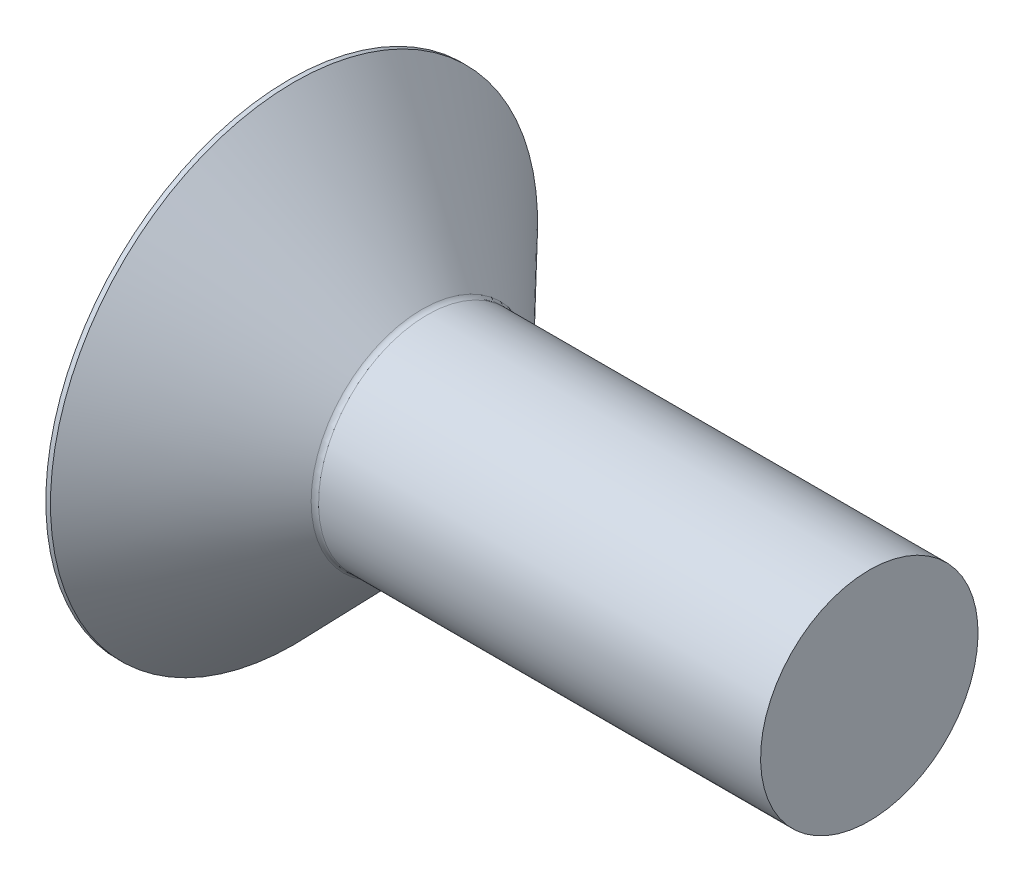
ISO-10303-21;
HEADER;
FILE_DESCRIPTION(('STEP AP214'),'2;1');
FILE_NAME('part.step','',(''),(''),'','','');
FILE_SCHEMA(('AUTOMOTIVE_DESIGN { 1 0 10303 214 1 1 1 1 }'));
ENDSEC;
DATA;
#1=APPLICATION_CONTEXT('core data for automotive mechanical design processes');
#2=APPLICATION_PROTOCOL_DEFINITION('international standard','automotive_design',2000,#1);
#3=PRODUCT_CONTEXT('',#1,'mechanical');
#4=PRODUCT('Part','Part','',(#3));
#5=PRODUCT_RELATED_PRODUCT_CATEGORY('part','',(#4));
#6=PRODUCT_DEFINITION_FORMATION('','',#4);
#7=PRODUCT_DEFINITION_CONTEXT('part definition',#1,'design');
#8=PRODUCT_DEFINITION('design','',#6,#7);
#9=PRODUCT_DEFINITION_SHAPE('','',#8);
#10=(LENGTH_UNIT() NAMED_UNIT(*) SI_UNIT(.MILLI.,.METRE.));
#11=(NAMED_UNIT(*) PLANE_ANGLE_UNIT() SI_UNIT($,.RADIAN.));
#12=(NAMED_UNIT(*) SI_UNIT($,.STERADIAN.) SOLID_ANGLE_UNIT());
#13=UNCERTAINTY_MEASURE_WITH_UNIT(LENGTH_MEASURE(1.E-05),#10,'distance_accuracy_value','');
#14=(GEOMETRIC_REPRESENTATION_CONTEXT(3) GLOBAL_UNCERTAINTY_ASSIGNED_CONTEXT((#13)) GLOBAL_UNIT_ASSIGNED_CONTEXT((#10,
#11,#12)) REPRESENTATION_CONTEXT('',''));
#15=CARTESIAN_POINT('',(0.,0.,0.));
#16=DIRECTION('',(0.,0.,1.));
#17=DIRECTION('',(1.,0.,0.));
#18=AXIS2_PLACEMENT_3D('',#15,#16,#17);
#19=CARTESIAN_POINT('',(0.,0.,0.));
#20=DIRECTION('',(1.,0.,0.));
#21=DIRECTION('',(0.,1.,0.));
#22=AXIS2_PLACEMENT_3D('',#19,#20,#21);
#23=PLANE('',#22);
#24=CARTESIAN_POINT('',(0.,0.,0.));
#25=DIRECTION('',(1.,0.,0.));
#26=DIRECTION('',(0.,1.,0.));
#27=AXIS2_PLACEMENT_3D('',#24,#25,#26);
#28=CIRCLE('',#27,1.5);
#29=CARTESIAN_POINT('',(0.,1.5,0.));
#30=VERTEX_POINT('',#29);
#31=EDGE_CURVE('E229',#30,#30,#28,.T.);
#32=ORIENTED_EDGE('',*,*,#31,.T.);
#33=EDGE_LOOP('',(#32));
#34=FACE_BOUND('',#33,.T.);
#35=ADVANCED_FACE('F53',(#34),#23,.T.);
#36=CARTESIAN_POINT('',(-8.,3.36,0.));
#37=DIRECTION('',(-1.,0.,0.));
#38=DIRECTION('',(0.,-1.,0.));
#39=AXIS2_PLACEMENT_3D('',#36,#37,#38);
#40=PLANE('',#39);
#41=CARTESIAN_POINT('',(-8.,0.,0.));
#42=DIRECTION('',(-1.,0.,0.));
#43=DIRECTION('',(0.,-1.,0.));
#44=AXIS2_PLACEMENT_3D('',#41,#42,#43);
#45=CIRCLE('',#44,1.15470053837925);
#46=CARTESIAN_POINT('',(-8.,-1.15470053837925,0.));
#47=VERTEX_POINT('',#46);
#48=CARTESIAN_POINT('',(-8.,-0.577350269189625,1.));
#49=VERTEX_POINT('',#48);
#50=EDGE_CURVE('E79',#47,#49,#45,.T.);
#51=ORIENTED_EDGE('',*,*,#50,.F.);
#52=CARTESIAN_POINT('',(-8.,-0.577350269189627,-0.999999999999999));
#53=VERTEX_POINT('',#52);
#54=EDGE_CURVE('E154',#53,#47,#45,.T.);
#55=ORIENTED_EDGE('',*,*,#54,.F.);
#56=CARTESIAN_POINT('',(-8.,0.577350269189625,-1.));
#57=VERTEX_POINT('',#56);
#58=EDGE_CURVE('E153',#57,#53,#45,.T.);
#59=ORIENTED_EDGE('',*,*,#58,.F.);
#60=CARTESIAN_POINT('',(-8.,1.15470053837925,0.));
#61=VERTEX_POINT('',#60);
#62=EDGE_CURVE('E122',#61,#57,#45,.T.);
#63=ORIENTED_EDGE('',*,*,#62,.F.);
#64=CARTESIAN_POINT('',(-8.,0.577350269189629,1.));
#65=VERTEX_POINT('',#64);
#66=EDGE_CURVE('E114',#65,#61,#45,.T.);
#67=ORIENTED_EDGE('',*,*,#66,.F.);
#68=EDGE_CURVE('E72',#49,#65,#45,.T.);
#69=ORIENTED_EDGE('',*,*,#68,.F.);
#70=EDGE_LOOP('',(#51,#55,#59,#63,#67,#69));
#71=FACE_BOUND('',#70,.T.);
#72=CARTESIAN_POINT('',(-8.,0.,0.));
#73=DIRECTION('',(1.,0.,0.));
#74=DIRECTION('',(0.,1.,0.));
#75=AXIS2_PLACEMENT_3D('',#72,#73,#74);
#76=CIRCLE('',#75,3.36);
#77=CARTESIAN_POINT('',(-8.,3.36,0.));
#78=VERTEX_POINT('',#77);
#79=EDGE_CURVE('E66',#78,#78,#76,.T.);
#80=ORIENTED_EDGE('',*,*,#79,.F.);
#81=EDGE_LOOP('',(#80));
#82=FACE_BOUND('',#81,.T.);
#83=ADVANCED_FACE('F149',(#71,#82),#40,.T.);
#84=CARTESIAN_POINT('',(0.,0.,0.));
#85=DIRECTION('',(1.,0.,0.));
#86=DIRECTION('',(0.,1.,0.));
#87=AXIS2_PLACEMENT_3D('',#84,#85,#86);
#88=CYLINDRICAL_SURFACE('',#87,3.36);
#89=ORIENTED_EDGE('',*,*,#79,.T.);
#90=EDGE_LOOP('',(#89));
#91=FACE_BOUND('',#90,.T.);
#92=CARTESIAN_POINT('',(-7.93618112114115,0.,0.));
#93=DIRECTION('',(1.,0.,0.));
#94=DIRECTION('',(0.,1.,0.));
#95=AXIS2_PLACEMENT_3D('',#92,#93,#94);
#96=CIRCLE('',#95,3.36);
#97=CARTESIAN_POINT('',(-7.93618112114115,3.36,0.));
#98=VERTEX_POINT('',#97);
#99=EDGE_CURVE('E243',#98,#98,#96,.T.);
#100=ORIENTED_EDGE('',*,*,#99,.F.);
#101=EDGE_LOOP('',(#100));
#102=FACE_BOUND('',#101,.T.);
#103=ADVANCED_FACE('F226',(#91,#102),#88,.T.);
#104=CARTESIAN_POINT('',(-6.1694864984129,0.,0.));
#105=DIRECTION('',(-1.,0.,0.));
#106=DIRECTION('',(0.,-1.,0.));
#107=AXIS2_PLACEMENT_3D('',#104,#105,#106);
#108=CONICAL_SURFACE('',#107,1.5305341629541,0.802851455917394);
#109=ORIENTED_EDGE('',*,*,#99,.T.);
#110=EDGE_LOOP('',(#109));
#111=FACE_BOUND('',#110,.T.);
#112=CARTESIAN_POINT('',(-6.1694864984129,0.,0.));
#113=DIRECTION('',(1.,0.,0.));
#114=DIRECTION('',(0.,1.,0.));
#115=AXIS2_PLACEMENT_3D('',#112,#113,#114);
#116=CIRCLE('',#115,1.5305341629541);
#117=CARTESIAN_POINT('',(-6.1694864984129,1.5305341629541,0.));
#118=VERTEX_POINT('',#117);
#119=EDGE_CURVE('E234',#118,#118,#116,.T.);
#120=ORIENTED_EDGE('',*,*,#119,.F.);
#121=EDGE_LOOP('',(#120));
#122=FACE_BOUND('',#121,.T.);
#123=ADVANCED_FACE('F250',(#111,#122),#108,.T.);
#124=CARTESIAN_POINT('',(-6.09755251837904,0.,0.));
#125=DIRECTION('',(1.,0.,0.));
#126=DIRECTION('',(0.,1.,0.));
#127=AXIS2_PLACEMENT_3D('',#124,#125,#126);
#128=TOROIDAL_SURFACE('',#127,1.6,0.0999999999999989);
#129=ORIENTED_EDGE('',*,*,#119,.T.);
#130=EDGE_LOOP('',(#129));
#131=FACE_BOUND('',#130,.T.);
#132=CARTESIAN_POINT('',(-6.09755251837904,0.,0.));
#133=DIRECTION('',(1.,0.,0.));
#134=DIRECTION('',(0.,1.,0.));
#135=AXIS2_PLACEMENT_3D('',#132,#133,#134);
#136=CIRCLE('',#135,1.5);
#137=CARTESIAN_POINT('',(-6.09755251837904,1.5,0.));
#138=VERTEX_POINT('',#137);
#139=EDGE_CURVE('E231',#138,#138,#136,.T.);
#140=ORIENTED_EDGE('',*,*,#139,.F.);
#141=EDGE_LOOP('',(#140));
#142=FACE_BOUND('',#141,.T.);
#143=ADVANCED_FACE('F256',(#131,#142),#128,.F.);
#144=CARTESIAN_POINT('',(0.,0.,0.));
#145=DIRECTION('',(1.,0.,0.));
#146=DIRECTION('',(0.,1.,0.));
#147=AXIS2_PLACEMENT_3D('',#144,#145,#146);
#148=CYLINDRICAL_SURFACE('',#147,1.5);
#149=ORIENTED_EDGE('',*,*,#139,.T.);
#150=EDGE_LOOP('',(#149));
#151=FACE_BOUND('',#150,.T.);
#152=ORIENTED_EDGE('',*,*,#31,.F.);
#153=EDGE_LOOP('',(#152));
#154=FACE_BOUND('',#153,.T.);
#155=ADVANCED_FACE('F262',(#151,#154),#148,.T.);
#156=CARTESIAN_POINT('',(-8.,0.,0.));
#157=DIRECTION('',(-1.,0.,0.));
#158=DIRECTION('',(0.,-1.,0.));
#159=AXIS2_PLACEMENT_3D('',#156,#157,#158);
#160=CONICAL_SURFACE('',#159,1.15470053837925,1.0471975511966);
#161=ORIENTED_EDGE('',*,*,#62,.T.);
#162=CARTESIAN_POINT('',(-8.00006667666567,1.15481600843309,0.000200000000000217));
#163=CARTESIAN_POINT('',(-7.98540897364915,1.12944301174833,-0.04374731939828));
#164=CARTESIAN_POINT('',(-7.9720777236209,1.10385100003722,-0.0880739839498205));
#165=CARTESIAN_POINT('',(-7.94880650762345,1.05222370923805,-0.177495074671122));
#166=CARTESIAN_POINT('',(-7.93887477654978,1.02618751195472,-0.222591091201731));
#167=CARTESIAN_POINT('',(-7.92341269488208,0.974437829480511,-0.312224170522619));
#168=CARTESIAN_POINT('',(-7.91777946809895,0.948732312346695,-0.35674743223322));
#169=CARTESIAN_POINT('',(-7.91105128864025,0.897200159195207,-0.446003739715018));
#170=CARTESIAN_POINT('',(-7.90995076792166,0.871373710819097,-0.490736460481495));
#171=CARTESIAN_POINT('',(-7.91222505229814,0.823104543442188,-0.574341110817347));
#172=CARTESIAN_POINT('',(-7.91504143886341,0.800654644281321,-0.613225476788767));
#173=CARTESIAN_POINT('',(-7.92397245021735,0.755901125586785,-0.690740844985187));
#174=CARTESIAN_POINT('',(-7.9300901337543,0.733597661157428,-0.729371578561639));
#175=CARTESIAN_POINT('',(-7.94538572572582,0.68875166842842,-0.807047116484145));
#176=CARTESIAN_POINT('',(-7.95462855216896,0.666214823887576,-0.846082076271167));
#177=CARTESIAN_POINT('',(-7.97560684575553,0.621477507484251,-0.923569381276012));
#178=CARTESIAN_POINT('',(-7.98733737513366,0.599276461273707,-0.962022721293859));
#179=CARTESIAN_POINT('',(-8.00006667666567,0.577234799135789,-1.0002));
#180=B_SPLINE_CURVE_WITH_KNOTS('',3,(#162,#163,#164,#165,#166,#167,#168,#169,#170,#171,#172,
#173,#174,#175,#176,#177,#178,#179),.UNSPECIFIED.,.F.,.F.,(4,2,2,2,2,2,2,2,4),(0.,
0.158523820030116,0.317428970089343,0.472400167924634,0.627180939971649,0.762016584872711,
0.896977373984233,1.03493410168667,1.17261952416172),.UNSPECIFIED.);
#181=EDGE_CURVE('E12',#61,#57,#180,.T.);
#182=ORIENTED_EDGE('',*,*,#181,.F.);
#183=EDGE_LOOP('',(#161,#182));
#184=FACE_BOUND('',#183,.T.);
#185=ADVANCED_FACE('F126',(#184),#160,.F.);
#186=ORIENTED_EDGE('',*,*,#58,.T.);
#187=CARTESIAN_POINT('',(-8.57852088846858,1.91088360252296,-0.999999999999999));
#188=CARTESIAN_POINT('',(-8.55562970162502,1.86613028354892,-0.999999999999999));
#189=CARTESIAN_POINT('',(-8.53287236303334,1.82130867619633,-0.999999999999999));
#190=CARTESIAN_POINT('',(-8.48768743007342,1.73149846074587,-0.999999999999999));
#191=CARTESIAN_POINT('',(-8.46525984272417,1.68650984911865,-0.999999999999999));
#192=CARTESIAN_POINT('',(-8.39849039033628,1.55109690651339,-0.999999999999999));
#193=CARTESIAN_POINT('',(-8.35474036314389,1.46037795308856,-0.999999999999999));
#194=CARTESIAN_POINT('',(-8.26745698277069,1.27317456530402,-0.999999999999999));
#195=CARTESIAN_POINT('',(-8.22404810955619,1.17663178027124,-0.999999999999999));
#196=CARTESIAN_POINT('',(-8.14150420786324,0.981755883768339,-0.999999999999999));
#197=CARTESIAN_POINT('',(-8.10236638493078,0.883423992613951,-0.999999999999999));
#198=CARTESIAN_POINT('',(-8.04597836869913,0.72504977104917,-0.999999999999999));
#199=CARTESIAN_POINT('',(-8.02634042527681,0.665867780378505,-0.999999999999999));
#200=CARTESIAN_POINT('',(-7.99060145374973,0.546456204092846,-0.999999999999999));
#201=CARTESIAN_POINT('',(-7.9744985596988,0.486227189347679,-0.999999999999999));
#202=CARTESIAN_POINT('',(-7.94728404539333,0.365799522937444,-0.999999999999999));
#203=CARTESIAN_POINT('',(-7.93608505755572,0.305621194131103,-0.999999999999999));
#204=CARTESIAN_POINT('',(-7.91944601610205,0.184476499792132,-0.999999999999999));
#205=CARTESIAN_POINT('',(-7.91400272239857,0.123510597200973,-0.999999999999999));
#206=CARTESIAN_POINT('',(-7.90958636197766,0.000621552593789378,-0.999999999999999));
#207=CARTESIAN_POINT('',(-7.91068942686791,-0.0613044657852316,-0.999999999999999));
#208=CARTESIAN_POINT('',(-7.91938022766406,-0.184702741463249,-0.999999999999999));
#209=CARTESIAN_POINT('',(-7.92697052478854,-0.246174809868826,-0.999999999999999));
#210=CARTESIAN_POINT('',(-7.94784492164254,-0.369351164254275,-0.999999999999999));
#211=CARTESIAN_POINT('',(-7.96123787494705,-0.431036317549765,-0.999999999999999));
#212=CARTESIAN_POINT('',(-7.99239798846754,-0.553275189845862,-0.999999999999999));
#213=CARTESIAN_POINT('',(-8.01016615587059,-0.613828644868054,-0.999999999999999));
#214=CARTESIAN_POINT('',(-8.04733836465562,-0.729043590736622,-0.999999999999999));
#215=CARTESIAN_POINT('',(-8.06649495880188,-0.783786452873275,-0.999999999999999));
#216=CARTESIAN_POINT('',(-8.10682703637643,-0.892528205605356,-0.999999999999999));
#217=CARTESIAN_POINT('',(-8.12800291891078,-0.946526946703743,-0.999999999999999));
#218=CARTESIAN_POINT('',(-8.19379197705252,-1.10770070301233,-0.999999999999999));
#219=CARTESIAN_POINT('',(-8.24063436504867,-1.213959950261,-0.999999999999999));
#220=CARTESIAN_POINT('',(-8.33512291780641,-1.41926974763978,-0.999999999999999));
#221=CARTESIAN_POINT('',(-8.38259360916089,-1.51840296405859,-0.999999999999999));
#222=CARTESIAN_POINT('',(-8.45519223954256,-1.66624250898825,-0.999999999999999));
#223=CARTESIAN_POINT('',(-8.47958807851382,-1.71530956407617,-0.999999999999999));
#224=CARTESIAN_POINT('',(-8.52877720020922,-1.8132393118916,-0.999999999999999));
#225=CARTESIAN_POINT('',(-8.55357045120262,-1.8621020205459,-0.999999999999999));
#226=CARTESIAN_POINT('',(-8.57852088846858,-1.91088360252296,-0.999999999999999));
#227=B_SPLINE_CURVE_WITH_KNOTS('',3,(#187,#188,#189,#190,#191,#192,#193,#194,#195,#196,#197,
#198,#199,#200,#201,#202,#203,#204,#205,#206,#207,#208,#209,#210,#211,#212,#213,#214,#215,#216,
#217,#218,#219,#220,#221,#222,#223,#224,#225,#226),.UNSPECIFIED.,.F.,.F.,(4,2,2,2,2,2,2,2,2,2,2,
2,2,2,2,2,2,2,2,4),(0.,0.150803021897754,0.301609249105586,0.603736207022126,0.921248104966657,
1.23855100036661,1.42553923434511,1.61242852955929,1.79583739247037,1.97914295287351,
2.16458443111534,2.35009915718633,2.53925584853051,2.72845612507412,2.90239982306954,
3.07637797203481,3.42462987107982,3.75434651037313,3.91873629321529,4.08311301534865),.UNSPECIFIED.);
#228=EDGE_CURVE('E156',#57,#53,#227,.T.);
#229=ORIENTED_EDGE('',*,*,#228,.F.);
#230=EDGE_LOOP('',(#186,#229));
#231=FACE_BOUND('',#230,.T.);
#232=ADVANCED_FACE('F271',(#231),#160,.F.);
#233=ORIENTED_EDGE('',*,*,#54,.T.);
#234=CARTESIAN_POINT('',(-8.00006667666566,-0.577234799135789,-1.0002));
#235=CARTESIAN_POINT('',(-7.98540897364914,-0.602607795820548,-0.956252680601719));
#236=CARTESIAN_POINT('',(-7.97207772362089,-0.628199807531658,-0.911926016050179));
#237=CARTESIAN_POINT('',(-7.94880650762345,-0.679827098330832,-0.822504925328877));
#238=CARTESIAN_POINT('',(-7.93887477654978,-0.705863295614159,-0.777408908798268));
#239=CARTESIAN_POINT('',(-7.92341269488208,-0.757612978088368,-0.68777582947738));
#240=CARTESIAN_POINT('',(-7.91777946809895,-0.783318495222184,-0.64325256776678));
#241=CARTESIAN_POINT('',(-7.91105128864025,-0.834850648373672,-0.553996260284982));
#242=CARTESIAN_POINT('',(-7.90995076792166,-0.860677096749781,-0.509263539518505));
#243=CARTESIAN_POINT('',(-7.91222505229814,-0.90894626412669,-0.425658889182652));
#244=CARTESIAN_POINT('',(-7.91504143886341,-0.931396163287557,-0.386774523211233));
#245=CARTESIAN_POINT('',(-7.92397245021735,-0.976149681982093,-0.309259155014813));
#246=CARTESIAN_POINT('',(-7.9300901337543,-0.998453146411451,-0.27062842143836));
#247=CARTESIAN_POINT('',(-7.94538572572582,-1.04329913914046,-0.192952883515854));
#248=CARTESIAN_POINT('',(-7.95462855216896,-1.0658359836813,-0.153917923728832));
#249=CARTESIAN_POINT('',(-7.97560684575553,-1.11057330008463,-0.0764306187239871));
#250=CARTESIAN_POINT('',(-7.98733737513366,-1.13277434629517,-0.03797727870614));
#251=CARTESIAN_POINT('',(-8.00006667666566,-1.15481600843309,0.000200000000000704));
#252=B_SPLINE_CURVE_WITH_KNOTS('',3,(#234,#235,#236,#237,#238,#239,#240,#241,#242,#243,#244,
#245,#246,#247,#248,#249,#250,#251),.UNSPECIFIED.,.F.,.F.,(4,2,2,2,2,2,2,2,4),(0.,
0.158523820030116,0.317428970089342,0.472400167924633,0.627180939971648,0.76201658487271,
0.896977373984232,1.03493410168667,1.17261952416172),.UNSPECIFIED.);
#253=EDGE_CURVE('E164',#53,#47,#252,.T.);
#254=ORIENTED_EDGE('',*,*,#253,.F.);
#255=EDGE_LOOP('',(#233,#254));
#256=FACE_BOUND('',#255,.T.);
#257=ADVANCED_FACE('F353',(#256),#160,.F.);
#258=ORIENTED_EDGE('',*,*,#50,.T.);
#259=CARTESIAN_POINT('',(-8.00006667666566,-1.15481600843309,-0.000199999999999317));
#260=CARTESIAN_POINT('',(-7.98540897364914,-1.12944301174833,0.0437473193982805));
#261=CARTESIAN_POINT('',(-7.97207772362089,-1.10385100003722,0.0880739839498209));
#262=CARTESIAN_POINT('',(-7.94880650762345,-1.05222370923805,0.177495074671123));
#263=CARTESIAN_POINT('',(-7.93887477654978,-1.02618751195472,0.222591091201732));
#264=CARTESIAN_POINT('',(-7.92341269488208,-0.97443782948051,0.312224170522619));
#265=CARTESIAN_POINT('',(-7.91777946809895,-0.948732312346695,0.35674743223322));
#266=CARTESIAN_POINT('',(-7.91105128864025,-0.897200159195207,0.446003739715018));
#267=CARTESIAN_POINT('',(-7.90995076792166,-0.871373710819097,0.490736460481495));
#268=CARTESIAN_POINT('',(-7.91222505229814,-0.823104543442188,0.574341110817347));
#269=CARTESIAN_POINT('',(-7.91504143886341,-0.800654644281321,0.613225476788767));
#270=CARTESIAN_POINT('',(-7.92397245021735,-0.755901125586785,0.690740844985187));
#271=CARTESIAN_POINT('',(-7.9300901337543,-0.733597661157427,0.72937157856164));
#272=CARTESIAN_POINT('',(-7.94538572572582,-0.688751668428419,0.807047116484145));
#273=CARTESIAN_POINT('',(-7.95462855216896,-0.666214823887576,0.846082076271168));
#274=CARTESIAN_POINT('',(-7.97560684575553,-0.62147750748425,0.923569381276012));
#275=CARTESIAN_POINT('',(-7.98733737513366,-0.599276461273706,0.962022721293859));
#276=CARTESIAN_POINT('',(-8.00006667666566,-0.577234799135788,1.0002));
#277=B_SPLINE_CURVE_WITH_KNOTS('',3,(#259,#260,#261,#262,#263,#264,#265,#266,#267,#268,#269,
#270,#271,#272,#273,#274,#275,#276),.UNSPECIFIED.,.F.,.F.,(4,2,2,2,2,2,2,2,4),(0.,
0.158523820030115,0.317428970089342,0.472400167924633,0.627180939971647,0.76201658487271,
0.896977373984232,1.03493410168667,1.17261952416172),.UNSPECIFIED.);
#278=EDGE_CURVE('E185',#47,#49,#277,.T.);
#279=ORIENTED_EDGE('',*,*,#278,.F.);
#280=EDGE_LOOP('',(#258,#279));
#281=FACE_BOUND('',#280,.T.);
#282=ADVANCED_FACE('F359',(#281),#160,.F.);
#283=ORIENTED_EDGE('',*,*,#68,.T.);
#284=CARTESIAN_POINT('',(-8.57852088846858,-1.91088360252296,1.));
#285=CARTESIAN_POINT('',(-8.55562970162502,-1.86613028354892,1.));
#286=CARTESIAN_POINT('',(-8.53287236303333,-1.82130867619633,1.));
#287=CARTESIAN_POINT('',(-8.48768743007342,-1.73149846074587,1.));
#288=CARTESIAN_POINT('',(-8.46525984272417,-1.68650984911865,1.));
#289=CARTESIAN_POINT('',(-8.39849039033628,-1.55109690651339,1.));
#290=CARTESIAN_POINT('',(-8.35474036314389,-1.46037795308856,1.));
#291=CARTESIAN_POINT('',(-8.26745698277069,-1.27317456530402,1.));
#292=CARTESIAN_POINT('',(-8.22404810955618,-1.17663178027124,1.));
#293=CARTESIAN_POINT('',(-8.14150420786324,-0.98175588376834,1.));
#294=CARTESIAN_POINT('',(-8.10236638493078,-0.883423992613951,1.));
#295=CARTESIAN_POINT('',(-8.04597836869913,-0.72504977104917,1.));
#296=CARTESIAN_POINT('',(-8.02634042527681,-0.665867780378505,1.));
#297=CARTESIAN_POINT('',(-7.99060145374973,-0.546456204092846,1.));
#298=CARTESIAN_POINT('',(-7.9744985596988,-0.486227189347679,1.));
#299=CARTESIAN_POINT('',(-7.94728404539333,-0.365799522937444,1.));
#300=CARTESIAN_POINT('',(-7.93608505755572,-0.305621194131103,1.));
#301=CARTESIAN_POINT('',(-7.91944601610205,-0.184476499792132,1.));
#302=CARTESIAN_POINT('',(-7.91400272239857,-0.123510597200972,1.));
#303=CARTESIAN_POINT('',(-7.90958636197766,-0.000621552593789052,1.));
#304=CARTESIAN_POINT('',(-7.91068942686791,0.0613044657852319,1.));
#305=CARTESIAN_POINT('',(-7.91938022766406,0.184702741463249,1.));
#306=CARTESIAN_POINT('',(-7.92697052478854,0.246174809868826,1.));
#307=CARTESIAN_POINT('',(-7.94784492164254,0.369351164254275,1.));
#308=CARTESIAN_POINT('',(-7.96123787494706,0.431036317549765,1.));
#309=CARTESIAN_POINT('',(-7.99239798846754,0.553275189845862,1.));
#310=CARTESIAN_POINT('',(-8.01016615587059,0.613828644868055,1.));
#311=CARTESIAN_POINT('',(-8.04733836465562,0.729043590736622,1.));
#312=CARTESIAN_POINT('',(-8.06649495880188,0.783786452873276,1.));
#313=CARTESIAN_POINT('',(-8.10682703637643,0.892528205605356,1.));
#314=CARTESIAN_POINT('',(-8.12800291891078,0.946526946703743,1.));
#315=CARTESIAN_POINT('',(-8.19379197705252,1.10770070301233,1.));
#316=CARTESIAN_POINT('',(-8.24063436504867,1.213959950261,1.));
#317=CARTESIAN_POINT('',(-8.33512291780642,1.41926974763978,1.));
#318=CARTESIAN_POINT('',(-8.3825936091609,1.51840296405859,1.));
#319=CARTESIAN_POINT('',(-8.45519223954256,1.66624250898825,1.));
#320=CARTESIAN_POINT('',(-8.47958807851382,1.71530956407617,1.));
#321=CARTESIAN_POINT('',(-8.52877720020923,1.8132393118916,1.));
#322=CARTESIAN_POINT('',(-8.55357045120262,1.8621020205459,1.));
#323=CARTESIAN_POINT('',(-8.57852088846858,1.91088360252296,1.));
#324=B_SPLINE_CURVE_WITH_KNOTS('',3,(#284,#285,#286,#287,#288,#289,#290,#291,#292,#293,#294,
#295,#296,#297,#298,#299,#300,#301,#302,#303,#304,#305,#306,#307,#308,#309,#310,#311,#312,#313,
#314,#315,#316,#317,#318,#319,#320,#321,#322,#323),.UNSPECIFIED.,.F.,.F.,(4,2,2,2,2,2,2,2,2,2,2,
2,2,2,2,2,2,2,2,4),(0.,0.150803021897753,0.301609249105584,0.603736207022125,0.921248104966655,
1.2385510003666,1.42553923434511,1.61242852955929,1.79583739247037,1.97914295287351,
2.16458443111534,2.35009915718633,2.53925584853051,2.72845612507412,2.90239982306954,
3.07637797203481,3.42462987107982,3.75434651037313,3.91873629321529,4.08311301534865),.UNSPECIFIED.);
#325=EDGE_CURVE('E140',#49,#65,#324,.T.);
#326=ORIENTED_EDGE('',*,*,#325,.F.);
#327=EDGE_LOOP('',(#283,#326));
#328=FACE_BOUND('',#327,.T.);
#329=ADVANCED_FACE('F177',(#328),#160,.F.);
#330=ORIENTED_EDGE('',*,*,#66,.T.);
#331=CARTESIAN_POINT('',(-8.00006667666567,0.577234799135789,1.0002));
#332=CARTESIAN_POINT('',(-7.98540897364915,0.602607795820549,0.95625268060172));
#333=CARTESIAN_POINT('',(-7.9720777236209,0.628199807531659,0.911926016050179));
#334=CARTESIAN_POINT('',(-7.94880650762345,0.679827098330832,0.822504925328877));
#335=CARTESIAN_POINT('',(-7.93887477654978,0.70586329561416,0.777408908798268));
#336=CARTESIAN_POINT('',(-7.92341269488208,0.757612978088369,0.68777582947738));
#337=CARTESIAN_POINT('',(-7.91777946809895,0.783318495222184,0.64325256776678));
#338=CARTESIAN_POINT('',(-7.91105128864025,0.834850648373673,0.553996260284982));
#339=CARTESIAN_POINT('',(-7.90995076792166,0.860677096749783,0.509263539518504));
#340=CARTESIAN_POINT('',(-7.91222505229814,0.908946264126691,0.425658889182652));
#341=CARTESIAN_POINT('',(-7.91504143886341,0.931396163287558,0.386774523211232));
#342=CARTESIAN_POINT('',(-7.92397245021735,0.976149681982094,0.309259155014813));
#343=CARTESIAN_POINT('',(-7.9300901337543,0.998453146411452,0.27062842143836));
#344=CARTESIAN_POINT('',(-7.94538572572582,1.04329913914046,0.192952883515854));
#345=CARTESIAN_POINT('',(-7.95462855216896,1.0658359836813,0.153917923728832));
#346=CARTESIAN_POINT('',(-7.97560684575553,1.11057330008463,0.0764306187239878));
#347=CARTESIAN_POINT('',(-7.98733737513366,1.13277434629517,0.0379772787061409));
#348=CARTESIAN_POINT('',(-8.00006667666567,1.15481600843309,-0.000199999999999853));
#349=B_SPLINE_CURVE_WITH_KNOTS('',3,(#331,#332,#333,#334,#335,#336,#337,#338,#339,#340,#341,
#342,#343,#344,#345,#346,#347,#348),.UNSPECIFIED.,.F.,.F.,(4,2,2,2,2,2,2,2,4),(0.,
0.158523820030116,0.317428970089343,0.472400167924634,0.627180939971649,0.762016584872712,
0.896977373984233,1.03493410168667,1.17261952416172),.UNSPECIFIED.);
#350=EDGE_CURVE('E118',#65,#61,#349,.T.);
#351=ORIENTED_EDGE('',*,*,#350,.F.);
#352=EDGE_LOOP('',(#330,#351));
#353=FACE_BOUND('',#352,.T.);
#354=ADVANCED_FACE('F116',(#353),#160,.F.);
#355=CARTESIAN_POINT('',(-6.8,0.,0.));
#356=DIRECTION('',(-1.,0.,0.));
#357=DIRECTION('',(0.,0.,1.));
#358=AXIS2_PLACEMENT_3D('',#355,#356,#357);
#359=CONICAL_SURFACE('',#358,1.15470053837925,1.0471975511966);
#360=CARTESIAN_POINT('',(-6.13333333333334,0.,0.));
#361=VERTEX_POINT('',#360);
#362=VERTEX_LOOP('',#361);
#363=FACE_BOUND('',#362,.T.);
#364=CARTESIAN_POINT('',(-6.80006667666567,-0.577234799135789,-1.0002));
#365=CARTESIAN_POINT('',(-6.78540897364915,-0.602607795820548,-0.956252680601719));
#366=CARTESIAN_POINT('',(-6.7720777236209,-0.628199807531658,-0.911926016050179));
#367=CARTESIAN_POINT('',(-6.74880650762346,-0.679827098330831,-0.822504925328877));
#368=CARTESIAN_POINT('',(-6.73887477654978,-0.705863295614159,-0.777408908798268));
#369=CARTESIAN_POINT('',(-6.72341269488208,-0.757612978088368,-0.687775829477381));
#370=CARTESIAN_POINT('',(-6.71777946809895,-0.783318495222183,-0.64325256776678));
#371=CARTESIAN_POINT('',(-6.71105128864026,-0.834850648373671,-0.553996260284982));
#372=CARTESIAN_POINT('',(-6.70995076792167,-0.860677096749781,-0.509263539518505));
#373=CARTESIAN_POINT('',(-6.71222505229814,-0.90894626412669,-0.425658889182653));
#374=CARTESIAN_POINT('',(-6.71504143886341,-0.931396163287557,-0.386774523211233));
#375=CARTESIAN_POINT('',(-6.72397245021735,-0.976149681982093,-0.309259155014813));
#376=CARTESIAN_POINT('',(-6.7300901337543,-0.998453146411451,-0.27062842143836));
#377=CARTESIAN_POINT('',(-6.74538572572582,-1.04329913914046,-0.192952883515854));
#378=CARTESIAN_POINT('',(-6.75462855216896,-1.0658359836813,-0.153917923728831));
#379=CARTESIAN_POINT('',(-6.77560684575553,-1.11057330008463,-0.0764306187239869));
#380=CARTESIAN_POINT('',(-6.78733737513366,-1.13277434629517,-0.0379772787061398));
#381=CARTESIAN_POINT('',(-6.80006667666567,-1.15481600843309,0.000200000000000695));
#382=B_SPLINE_CURVE_WITH_KNOTS('',3,(#364,#365,#366,#367,#368,#369,#370,#371,#372,#373,#374,
#375,#376,#377,#378,#379,#380,#381),.UNSPECIFIED.,.F.,.F.,(4,2,2,2,2,2,2,2,4),(0.,
0.158523820030115,0.317428970089342,0.472400167924633,0.627180939971648,0.762016584872711,
0.896977373984232,1.03493410168667,1.17261952416172),.UNSPECIFIED.);
#383=CARTESIAN_POINT('',(-6.8,-0.577350269189627,-0.999999999999999));
#384=VERTEX_POINT('',#383);
#385=CARTESIAN_POINT('',(-6.8,-1.15470053837925,0.));
#386=VERTEX_POINT('',#385);
#387=EDGE_CURVE('E139',#384,#386,#382,.T.);
#388=ORIENTED_EDGE('',*,*,#387,.T.);
#389=CARTESIAN_POINT('',(-6.80006667666567,-1.15481600843309,-0.000199999999999566));
#390=CARTESIAN_POINT('',(-6.78540897364915,-1.12944301174833,0.0437473193982805));
#391=CARTESIAN_POINT('',(-6.7720777236209,-1.10385100003722,0.0880739839498208));
#392=CARTESIAN_POINT('',(-6.74880650762346,-1.05222370923805,0.177495074671122));
#393=CARTESIAN_POINT('',(-6.73887477654978,-1.02618751195472,0.222591091201732));
#394=CARTESIAN_POINT('',(-6.72341269488208,-0.97443782948051,0.312224170522619));
#395=CARTESIAN_POINT('',(-6.71777946809895,-0.948732312346695,0.35674743223322));
#396=CARTESIAN_POINT('',(-6.71105128864026,-0.897200159195206,0.446003739715018));
#397=CARTESIAN_POINT('',(-6.70995076792167,-0.871373710819096,0.490736460481495));
#398=CARTESIAN_POINT('',(-6.71222505229814,-0.823104543442188,0.574341110817347));
#399=CARTESIAN_POINT('',(-6.71504143886341,-0.80065464428132,0.613225476788767));
#400=CARTESIAN_POINT('',(-6.72397245021735,-0.755901125586784,0.690740844985187));
#401=CARTESIAN_POINT('',(-6.7300901337543,-0.733597661157427,0.72937157856164));
#402=CARTESIAN_POINT('',(-6.74538572572582,-0.688751668428419,0.807047116484146));
#403=CARTESIAN_POINT('',(-6.75462855216896,-0.666214823887575,0.846082076271168));
#404=CARTESIAN_POINT('',(-6.77560684575553,-0.62147750748425,0.923569381276012));
#405=CARTESIAN_POINT('',(-6.78733737513366,-0.599276461273706,0.962022721293859));
#406=CARTESIAN_POINT('',(-6.80006667666567,-0.577234799135788,1.0002));
#407=B_SPLINE_CURVE_WITH_KNOTS('',3,(#389,#390,#391,#392,#393,#394,#395,#396,#397,#398,#399,
#400,#401,#402,#403,#404,#405,#406),.UNSPECIFIED.,.F.,.F.,(4,2,2,2,2,2,2,2,4),(0.,
0.158523820030115,0.317428970089343,0.472400167924634,0.627180939971648,0.762016584872711,
0.896977373984233,1.03493410168667,1.17261952416172),.UNSPECIFIED.);
#408=CARTESIAN_POINT('',(-6.8,-0.577350269189626,1.));
#409=VERTEX_POINT('',#408);
#410=EDGE_CURVE('E287',#386,#409,#407,.T.);
#411=ORIENTED_EDGE('',*,*,#410,.T.);
#412=CARTESIAN_POINT('',(-7.17183528873947,-1.49514512143373,1.));
#413=CARTESIAN_POINT('',(-7.15111502079343,-1.4519612611533,1.));
#414=CARTESIAN_POINT('',(-7.13061367234947,-1.40867282404236,1.));
#415=CARTESIAN_POINT('',(-7.0901634335246,-1.32182947914247,1.));
#416=CARTESIAN_POINT('',(-7.07021464256729,-1.27827452509756,1.));
#417=CARTESIAN_POINT('',(-7.01114515483648,-1.14662339890625,1.));
#418=CARTESIAN_POINT('',(-6.97305252653304,-1.05805724149108,1.));
#419=CARTESIAN_POINT('',(-6.90024582070057,-0.876833003172495,1.));
#420=CARTESIAN_POINT('',(-6.86564584045392,-0.784128452056494,1.));
#421=CARTESIAN_POINT('',(-6.80407347381845,-0.59633174653213,1.));
#422=CARTESIAN_POINT('',(-6.77708128484786,-0.501246505541256,1.));
#423=CARTESIAN_POINT('',(-6.74577577003502,-0.356699986452703,1.));
#424=CARTESIAN_POINT('',(-6.73687509854699,-0.308244163171709,1.));
#425=CARTESIAN_POINT('',(-6.72274243175691,-0.210788870695443,1.));
#426=CARTESIAN_POINT('',(-6.71751018853518,-0.161789438465742,1.));
#427=CARTESIAN_POINT('',(-6.71119898098177,-0.0641060489970655,1.));
#428=CARTESIAN_POINT('',(-6.71007100501111,-0.0154253461269764,1.));
#429=CARTESIAN_POINT('',(-6.71193297830514,0.0818553564032762,1.));
#430=CARTESIAN_POINT('',(-6.71492318255361,0.130455350879703,1.));
#431=CARTESIAN_POINT('',(-6.7271183217293,0.250369589613779,1.));
#432=CARTESIAN_POINT('',(-6.73860856098489,0.321451919115028,1.));
#433=CARTESIAN_POINT('',(-6.76824031739763,0.462229038490169,1.));
#434=CARTESIAN_POINT('',(-6.78638985094493,0.531922048861734,1.));
#435=CARTESIAN_POINT('',(-6.82786972268665,0.671415729806807,1.));
#436=CARTESIAN_POINT('',(-6.85130716830693,0.741183729418072,1.));
#437=CARTESIAN_POINT('',(-6.90156448824641,0.87943831939629,1.));
#438=CARTESIAN_POINT('',(-6.92838317523047,0.947925349932562,1.));
#439=CARTESIAN_POINT('',(-7.0000539154734,1.12214515906645,1.));
#440=CARTESIAN_POINT('',(-7.04657230519899,1.22718574040678,1.));
#441=CARTESIAN_POINT('',(-7.14287692224798,1.43575968104558,1.));
#442=CARTESIAN_POINT('',(-7.19266398782224,1.53929264533348,1.));
#443=CARTESIAN_POINT('',(-7.29433644453464,1.74546702338822,1.));
#444=CARTESIAN_POINT('',(-7.34622418186697,1.84810727553999,1.));
#445=CARTESIAN_POINT('',(-7.45133836883522,2.05270058021726,1.));
#446=CARTESIAN_POINT('',(-7.50456486267233,2.15465360991173,1.));
#447=CARTESIAN_POINT('',(-7.6068669169112,2.34846553091283,1.));
#448=CARTESIAN_POINT('',(-7.65585965896404,2.44036823161571,1.));
#449=CARTESIAN_POINT('',(-7.75440313282821,2.623877990053,1.));
#450=CARTESIAN_POINT('',(-7.80395388528948,2.71548503668387,1.));
#451=CARTESIAN_POINT('',(-7.90334710767982,2.89823865557593,1.));
#452=CARTESIAN_POINT('',(-7.95318851504101,2.98938580641155,1.));
#453=CARTESIAN_POINT('',(-8.05319572337612,3.17149583112622,1.));
#454=CARTESIAN_POINT('',(-8.10336150723715,3.26245871439935,1.));
#455=CARTESIAN_POINT('',(-8.15364621220496,3.35335539208176,1.));
#456=B_SPLINE_CURVE_WITH_KNOTS('',3,(#412,#413,#414,#415,#416,#417,#418,#419,#420,#421,#422,
#423,#424,#425,#426,#427,#428,#429,#430,#431,#432,#433,#434,#435,#436,#437,#438,#439,#440,#441,
#442,#443,#444,#445,#446,#447,#448,#449,#450,#451,#452,#453,#454,#455),.UNSPECIFIED.,.F.,.F.,(4,
2,2,2,2,2,2,2,2,2,2,2,2,2,2,2,2,2,2,2,2,4),(0.,0.143690341820649,0.287406372566271,
0.57656033287749,0.873259488934029,1.16917907000006,1.31686338831957,1.46453772487642,
1.61044269221658,1.75635669390451,1.97192533331897,2.18775432802313,2.40842600301165,
2.62902040304935,2.97355048126458,3.31816926186283,3.66318417395131,4.00821049225242,
4.32064609598596,4.63309330006988,4.94474578248761,5.25638195528641),.UNSPECIFIED.);
#457=CARTESIAN_POINT('',(-6.8,0.577350269189627,1.));
#458=VERTEX_POINT('',#457);
#459=EDGE_CURVE('E290',#409,#458,#456,.T.);
#460=ORIENTED_EDGE('',*,*,#459,.T.);
#461=CARTESIAN_POINT('',(-6.80006667666567,0.577234799135789,1.0002));
#462=CARTESIAN_POINT('',(-6.78540897364915,0.602607795820549,0.95625268060172));
#463=CARTESIAN_POINT('',(-6.7720777236209,0.628199807531659,0.91192601605018));
#464=CARTESIAN_POINT('',(-6.74880650762346,0.679827098330832,0.822504925328878));
#465=CARTESIAN_POINT('',(-6.73887477654978,0.705863295614159,0.777408908798268));
#466=CARTESIAN_POINT('',(-6.72341269488208,0.757612978088369,0.687775829477381));
#467=CARTESIAN_POINT('',(-6.71777946809895,0.783318495222184,0.643252567766781));
#468=CARTESIAN_POINT('',(-6.71105128864026,0.834850648373672,0.553996260284983));
#469=CARTESIAN_POINT('',(-6.70995076792167,0.860677096749782,0.509263539518505));
#470=CARTESIAN_POINT('',(-6.71222505229814,0.908946264126691,0.425658889182653));
#471=CARTESIAN_POINT('',(-6.71504143886341,0.931396163287558,0.386774523211233));
#472=CARTESIAN_POINT('',(-6.72397245021735,0.976149681982094,0.309259155014813));
#473=CARTESIAN_POINT('',(-6.7300901337543,0.998453146411452,0.27062842143836));
#474=CARTESIAN_POINT('',(-6.74538572572582,1.04329913914046,0.192952883515855));
#475=CARTESIAN_POINT('',(-6.75462855216896,1.0658359836813,0.153917923728832));
#476=CARTESIAN_POINT('',(-6.77560684575553,1.11057330008463,0.076430618723988));
#477=CARTESIAN_POINT('',(-6.78733737513366,1.13277434629517,0.037977278706141));
#478=CARTESIAN_POINT('',(-6.80006667666567,1.15481600843309,-0.000199999999999839));
#479=B_SPLINE_CURVE_WITH_KNOTS('',3,(#461,#462,#463,#464,#465,#466,#467,#468,#469,#470,#471,
#472,#473,#474,#475,#476,#477,#478),.UNSPECIFIED.,.F.,.F.,(4,2,2,2,2,2,2,2,4),(0.,
0.158523820030116,0.317428970089343,0.472400167924633,0.627180939971648,0.762016584872711,
0.896977373984233,1.03493410168667,1.17261952416172),.UNSPECIFIED.);
#480=CARTESIAN_POINT('',(-6.8,1.15470053837925,0.));
#481=VERTEX_POINT('',#480);
#482=EDGE_CURVE('E316',#458,#481,#479,.T.);
#483=ORIENTED_EDGE('',*,*,#482,.T.);
#484=CARTESIAN_POINT('',(-6.80006667666567,1.15481600843309,0.000200000000000217));
#485=CARTESIAN_POINT('',(-6.78540897364915,1.12944301174833,-0.0437473193982799));
#486=CARTESIAN_POINT('',(-6.7720777236209,1.10385100003722,-0.0880739839498202));
#487=CARTESIAN_POINT('',(-6.74880650762346,1.05222370923805,-0.177495074671122));
#488=CARTESIAN_POINT('',(-6.73887477654978,1.02618751195472,-0.222591091201731));
#489=CARTESIAN_POINT('',(-6.72341269488208,0.974437829480511,-0.312224170522619));
#490=CARTESIAN_POINT('',(-6.71777946809895,0.948732312346696,-0.356747432233219));
#491=CARTESIAN_POINT('',(-6.71105128864026,0.897200159195208,-0.446003739715017));
#492=CARTESIAN_POINT('',(-6.70995076792167,0.871373710819098,-0.490736460481494));
#493=CARTESIAN_POINT('',(-6.71222505229814,0.823104543442189,-0.574341110817347));
#494=CARTESIAN_POINT('',(-6.71504143886341,0.800654644281322,-0.613225476788766));
#495=CARTESIAN_POINT('',(-6.72397245021735,0.755901125586786,-0.690740844985186));
#496=CARTESIAN_POINT('',(-6.7300901337543,0.733597661157428,-0.729371578561639));
#497=CARTESIAN_POINT('',(-6.74538572572582,0.68875166842842,-0.807047116484145));
#498=CARTESIAN_POINT('',(-6.75462855216896,0.666214823887576,-0.846082076271167));
#499=CARTESIAN_POINT('',(-6.77560684575553,0.621477507484251,-0.923569381276012));
#500=CARTESIAN_POINT('',(-6.78733737513366,0.599276461273707,-0.962022721293858));
#501=CARTESIAN_POINT('',(-6.80006667666567,0.577234799135789,-1.0002));
#502=B_SPLINE_CURVE_WITH_KNOTS('',3,(#484,#485,#486,#487,#488,#489,#490,#491,#492,#493,#494,
#495,#496,#497,#498,#499,#500,#501),.UNSPECIFIED.,.F.,.F.,(4,2,2,2,2,2,2,2,4),(0.,
0.158523820030116,0.317428970089343,0.472400167924634,0.627180939971648,0.762016584872711,
0.896977373984233,1.03493410168667,1.17261952416172),.UNSPECIFIED.);
#503=CARTESIAN_POINT('',(-6.8,0.577350269189627,-0.999999999999999));
#504=VERTEX_POINT('',#503);
#505=EDGE_CURVE('E144',#481,#504,#502,.T.);
#506=ORIENTED_EDGE('',*,*,#505,.T.);
#507=CARTESIAN_POINT('',(-7.17183528873947,-1.49514512143373,-0.999999999999999));
#508=CARTESIAN_POINT('',(-7.15111502079343,-1.4519612611533,-0.999999999999999));
#509=CARTESIAN_POINT('',(-7.13061367234947,-1.40867282404236,-0.999999999999999));
#510=CARTESIAN_POINT('',(-7.0901634335246,-1.32182947914247,-0.999999999999999));
#511=CARTESIAN_POINT('',(-7.07021464256729,-1.27827452509756,-0.999999999999999));
#512=CARTESIAN_POINT('',(-7.01114515483648,-1.14662339890625,-0.999999999999999));
#513=CARTESIAN_POINT('',(-6.97305252653304,-1.05805724149108,-0.999999999999999));
#514=CARTESIAN_POINT('',(-6.90024582070057,-0.876833003172496,-0.999999999999999));
#515=CARTESIAN_POINT('',(-6.86564584045392,-0.784128452056495,-0.999999999999999));
#516=CARTESIAN_POINT('',(-6.80407347381845,-0.59633174653213,-0.999999999999999));
#517=CARTESIAN_POINT('',(-6.77708128484785,-0.501246505541256,-0.999999999999999));
#518=CARTESIAN_POINT('',(-6.74577577003502,-0.356699986452703,-0.999999999999999));
#519=CARTESIAN_POINT('',(-6.73687509854699,-0.308244163171709,-0.999999999999999));
#520=CARTESIAN_POINT('',(-6.72274243175691,-0.210788870695443,-0.999999999999999));
#521=CARTESIAN_POINT('',(-6.71751018853518,-0.161789438465742,-0.999999999999999));
#522=CARTESIAN_POINT('',(-6.71119898098177,-0.0641060489970664,-0.999999999999999));
#523=CARTESIAN_POINT('',(-6.71007100501111,-0.0154253461269774,-0.999999999999999));
#524=CARTESIAN_POINT('',(-6.71193297830514,0.081855356403275,-0.999999999999999));
#525=CARTESIAN_POINT('',(-6.71492318255361,0.130455350879702,-0.999999999999999));
#526=CARTESIAN_POINT('',(-6.7271183217293,0.250369589613778,-0.999999999999999));
#527=CARTESIAN_POINT('',(-6.73860856098489,0.321451919115027,-0.999999999999999));
#528=CARTESIAN_POINT('',(-6.76824031739763,0.462229038490167,-0.999999999999999));
#529=CARTESIAN_POINT('',(-6.78638985094493,0.531922048861732,-0.999999999999999));
#530=CARTESIAN_POINT('',(-6.82786972268665,0.671415729806804,-0.999999999999999));
#531=CARTESIAN_POINT('',(-6.85130716830693,0.741183729418069,-0.999999999999999));
#532=CARTESIAN_POINT('',(-6.90156448824641,0.879438319396287,-0.999999999999999));
#533=CARTESIAN_POINT('',(-6.92838317523047,0.947925349932559,-0.999999999999999));
#534=CARTESIAN_POINT('',(-7.0000539154734,1.12214515906644,-0.999999999999999));
#535=CARTESIAN_POINT('',(-7.04657230519898,1.22718574040678,-0.999999999999999));
#536=CARTESIAN_POINT('',(-7.14287692224798,1.43575968104558,-0.999999999999999));
#537=CARTESIAN_POINT('',(-7.19266398782224,1.53929264533347,-0.999999999999999));
#538=CARTESIAN_POINT('',(-7.29433644453464,1.74546702338821,-0.999999999999999));
#539=CARTESIAN_POINT('',(-7.34622418186697,1.84810727553999,-0.999999999999999));
#540=CARTESIAN_POINT('',(-7.45133836883522,2.05270058021726,-0.999999999999999));
#541=CARTESIAN_POINT('',(-7.50456486267233,2.15465360991172,-0.999999999999999));
#542=CARTESIAN_POINT('',(-7.6068669169112,2.34846553091283,-0.999999999999999));
#543=CARTESIAN_POINT('',(-7.65585965896404,2.44036823161571,-0.999999999999999));
#544=CARTESIAN_POINT('',(-7.75440313282821,2.623877990053,-0.999999999999999));
#545=CARTESIAN_POINT('',(-7.80395388528948,2.71548503668387,-0.999999999999999));
#546=CARTESIAN_POINT('',(-7.90334710767982,2.89823865557593,-0.999999999999999));
#547=CARTESIAN_POINT('',(-7.95318851504101,2.98938580641155,-0.999999999999999));
#548=CARTESIAN_POINT('',(-8.05319572337612,3.17149583112622,-0.999999999999999));
#549=CARTESIAN_POINT('',(-8.10336150723714,3.26245871439935,-0.999999999999999));
#550=CARTESIAN_POINT('',(-8.15364621220496,3.35335539208175,-0.999999999999999));
#551=B_SPLINE_CURVE_WITH_KNOTS('',3,(#507,#508,#509,#510,#511,#512,#513,#514,#515,#516,#517,
#518,#519,#520,#521,#522,#523,#524,#525,#526,#527,#528,#529,#530,#531,#532,#533,#534,#535,#536,
#537,#538,#539,#540,#541,#542,#543,#544,#545,#546,#547,#548,#549,#550),.UNSPECIFIED.,.F.,.F.,(4,
2,2,2,2,2,2,2,2,2,2,2,2,2,2,2,2,2,2,2,2,4),(0.,0.14369034182065,0.287406372566272,
0.57656033287749,0.873259488934028,1.16917907000006,1.31686338831957,1.46453772487642,
1.61044269221658,1.75635669390451,1.97192533331897,2.18775432802313,2.40842600301164,
2.62902040304935,2.97355048126458,3.31816926186283,3.6631841739513,4.00821049225242,
4.32064609598596,4.63309330006987,4.9447457824876,5.2563819552864),.UNSPECIFIED.);
#552=EDGE_CURVE('E146',#504,#384,#551,.F.);
#553=ORIENTED_EDGE('',*,*,#552,.T.);
#554=EDGE_LOOP('',(#388,#411,#460,#483,#506,#553));
#555=FACE_BOUND('',#554,.T.);
#556=ADVANCED_FACE('F176',(#363,#555),#359,.F.);
#557=CARTESIAN_POINT('',(-6.8,1.15470053837925,0.));
#558=DIRECTION('',(0.,0.866025403784439,-0.5));
#559=DIRECTION('',(0.,0.5,0.866025403784439));
#560=AXIS2_PLACEMENT_3D('',#557,#558,#559);
#561=PLANE('',#560);
#562=DIRECTION('',(-1.,0.,0.));
#563=VECTOR('',#562,1.);
#564=CARTESIAN_POINT('',(-6.8,1.15470053837925,0.));
#565=LINE('',#564,#563);
#566=EDGE_CURVE('E135',#481,#61,#565,.T.);
#567=ORIENTED_EDGE('',*,*,#566,.T.);
#568=ORIENTED_EDGE('',*,*,#181,.T.);
#569=DIRECTION('',(-1.,0.,0.));
#570=VECTOR('',#569,1.);
#571=CARTESIAN_POINT('',(-6.8,0.577350269189627,-0.999999999999999));
#572=LINE('',#571,#570);
#573=EDGE_CURVE('E145',#504,#57,#572,.T.);
#574=ORIENTED_EDGE('',*,*,#573,.F.);
#575=ORIENTED_EDGE('',*,*,#505,.F.);
#576=EDGE_LOOP('',(#567,#568,#574,#575));
#577=FACE_BOUND('',#576,.T.);
#578=ADVANCED_FACE('F142',(#577),#561,.F.);
#579=CARTESIAN_POINT('',(-6.8,0.577350269189627,-0.999999999999999));
#580=DIRECTION('',(0.,0.,-1.));
#581=DIRECTION('',(-1.,0.,0.));
#582=AXIS2_PLACEMENT_3D('',#579,#580,#581);
#583=PLANE('',#582);
#584=ORIENTED_EDGE('',*,*,#573,.T.);
#585=ORIENTED_EDGE('',*,*,#228,.T.);
#586=DIRECTION('',(-1.,0.,0.));
#587=VECTOR('',#586,1.);
#588=CARTESIAN_POINT('',(-6.8,-0.577350269189627,-0.999999999999999));
#589=LINE('',#588,#587);
#590=EDGE_CURVE('E347',#384,#53,#589,.T.);
#591=ORIENTED_EDGE('',*,*,#590,.F.);
#592=ORIENTED_EDGE('',*,*,#552,.F.);
#593=EDGE_LOOP('',(#584,#585,#591,#592));
#594=FACE_BOUND('',#593,.T.);
#595=ADVANCED_FACE('F171',(#594),#583,.F.);
#596=CARTESIAN_POINT('',(-6.8,-0.577350269189627,-0.999999999999999));
#597=DIRECTION('',(0.,-0.866025403784439,-0.499999999999999));
#598=DIRECTION('',(0.,0.5,-0.866025403784439));
#599=AXIS2_PLACEMENT_3D('',#596,#597,#598);
#600=PLANE('',#599);
#601=ORIENTED_EDGE('',*,*,#590,.T.);
#602=ORIENTED_EDGE('',*,*,#253,.T.);
#603=DIRECTION('',(-1.,0.,0.));
#604=VECTOR('',#603,1.);
#605=CARTESIAN_POINT('',(-6.8,-1.15470053837925,0.));
#606=LINE('',#605,#604);
#607=EDGE_CURVE('E344',#386,#47,#606,.T.);
#608=ORIENTED_EDGE('',*,*,#607,.F.);
#609=ORIENTED_EDGE('',*,*,#387,.F.);
#610=EDGE_LOOP('',(#601,#602,#608,#609));
#611=FACE_BOUND('',#610,.T.);
#612=ADVANCED_FACE('F212',(#611),#600,.F.);
#613=CARTESIAN_POINT('',(-6.8,-1.15470053837925,0.));
#614=DIRECTION('',(0.,-0.866025403784439,0.5));
#615=DIRECTION('',(0.,-0.5,-0.866025403784439));
#616=AXIS2_PLACEMENT_3D('',#613,#614,#615);
#617=PLANE('',#616);
#618=ORIENTED_EDGE('',*,*,#607,.T.);
#619=ORIENTED_EDGE('',*,*,#278,.T.);
#620=DIRECTION('',(-1.,0.,0.));
#621=VECTOR('',#620,1.);
#622=CARTESIAN_POINT('',(-6.8,-0.577350269189626,1.));
#623=LINE('',#622,#621);
#624=EDGE_CURVE('E236',#409,#49,#623,.T.);
#625=ORIENTED_EDGE('',*,*,#624,.F.);
#626=ORIENTED_EDGE('',*,*,#410,.F.);
#627=EDGE_LOOP('',(#618,#619,#625,#626));
#628=FACE_BOUND('',#627,.T.);
#629=ADVANCED_FACE('F207',(#628),#617,.F.);
#630=CARTESIAN_POINT('',(-6.8,-0.577350269189626,1.));
#631=DIRECTION('',(0.,0.,1.));
#632=DIRECTION('',(1.,0.,0.));
#633=AXIS2_PLACEMENT_3D('',#630,#631,#632);
#634=PLANE('',#633);
#635=ORIENTED_EDGE('',*,*,#624,.T.);
#636=ORIENTED_EDGE('',*,*,#325,.T.);
#637=DIRECTION('',(-1.,0.,0.));
#638=VECTOR('',#637,1.);
#639=CARTESIAN_POINT('',(-6.8,0.577350269189627,1.));
#640=LINE('',#639,#638);
#641=EDGE_CURVE('E138',#458,#65,#640,.T.);
#642=ORIENTED_EDGE('',*,*,#641,.F.);
#643=ORIENTED_EDGE('',*,*,#459,.F.);
#644=EDGE_LOOP('',(#635,#636,#642,#643));
#645=FACE_BOUND('',#644,.T.);
#646=ADVANCED_FACE('F203',(#645),#634,.F.);
#647=CARTESIAN_POINT('',(-6.8,0.577350269189627,1.));
#648=DIRECTION('',(0.,0.866025403784439,0.5));
#649=DIRECTION('',(0.,-0.5,0.866025403784439));
#650=AXIS2_PLACEMENT_3D('',#647,#648,#649);
#651=PLANE('',#650);
#652=ORIENTED_EDGE('',*,*,#641,.T.);
#653=ORIENTED_EDGE('',*,*,#350,.T.);
#654=ORIENTED_EDGE('',*,*,#566,.F.);
#655=ORIENTED_EDGE('',*,*,#482,.F.);
#656=EDGE_LOOP('',(#652,#653,#654,#655));
#657=FACE_BOUND('',#656,.T.);
#658=ADVANCED_FACE('F134',(#657),#651,.F.);
#659=CLOSED_SHELL('',(#35,#83,#103,#123,#143,#155,#185,#232,#257,#282,#329,#354,#556,#578,#595,
#612,#629,#646,#658));
#660=MANIFOLD_SOLID_BREP('B2',#659);
#661=ADVANCED_BREP_SHAPE_REPRESENTATION('',(#18,#660),#14);
#662=SHAPE_DEFINITION_REPRESENTATION(#9,#661);
ENDSEC;
END-ISO-10303-21;
